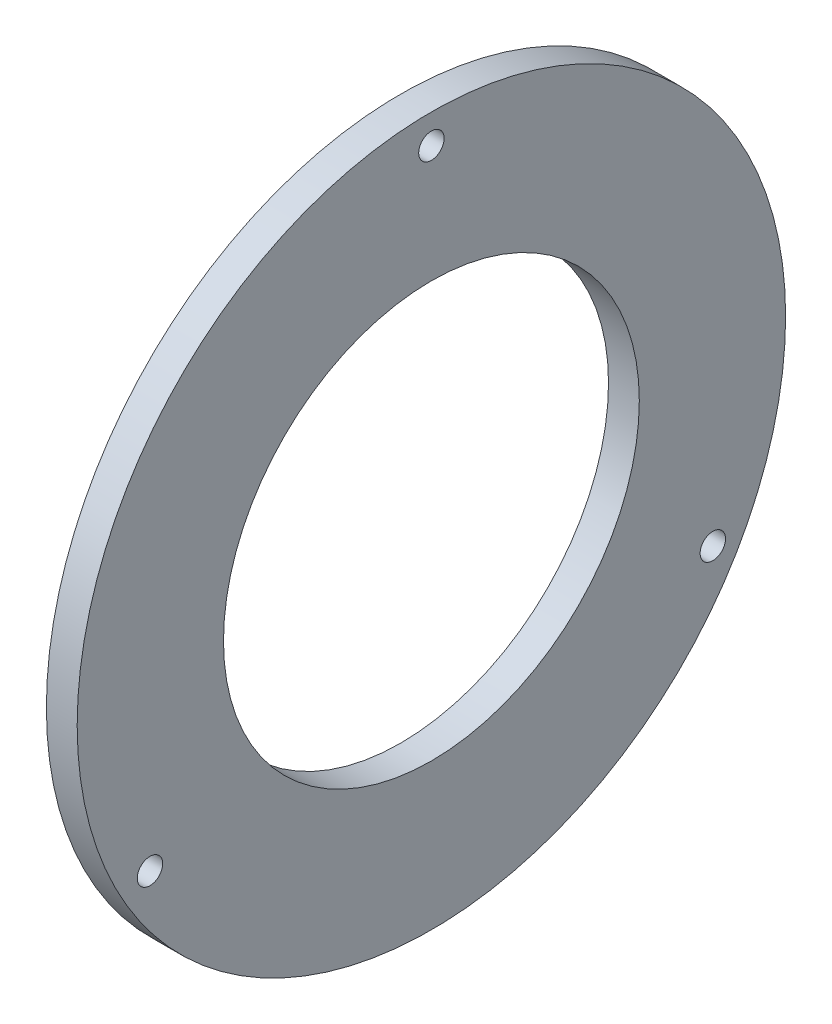
ISO-10303-21;
HEADER;
FILE_DESCRIPTION(('STEP AP214'),'2;1');
FILE_NAME('part.step','',(''),(''),'','','');
FILE_SCHEMA(('AUTOMOTIVE_DESIGN { 1 0 10303 214 1 1 1 1 }'));
ENDSEC;
DATA;
#1=APPLICATION_CONTEXT('core data for automotive mechanical design processes');
#2=APPLICATION_PROTOCOL_DEFINITION('international standard','automotive_design',2000,#1);
#3=PRODUCT_CONTEXT('',#1,'mechanical');
#4=PRODUCT('Part','Part','',(#3));
#5=PRODUCT_RELATED_PRODUCT_CATEGORY('part','',(#4));
#6=PRODUCT_DEFINITION_FORMATION('','',#4);
#7=PRODUCT_DEFINITION_CONTEXT('part definition',#1,'design');
#8=PRODUCT_DEFINITION('design','',#6,#7);
#9=PRODUCT_DEFINITION_SHAPE('','',#8);
#10=(LENGTH_UNIT() NAMED_UNIT(*) SI_UNIT(.MILLI.,.METRE.));
#11=(NAMED_UNIT(*) PLANE_ANGLE_UNIT() SI_UNIT($,.RADIAN.));
#12=(NAMED_UNIT(*) SI_UNIT($,.STERADIAN.) SOLID_ANGLE_UNIT());
#13=UNCERTAINTY_MEASURE_WITH_UNIT(LENGTH_MEASURE(1.E-05),#10,'distance_accuracy_value','');
#14=(GEOMETRIC_REPRESENTATION_CONTEXT(3) GLOBAL_UNCERTAINTY_ASSIGNED_CONTEXT((#13)) GLOBAL_UNIT_ASSIGNED_CONTEXT((#10,
#11,#12)) REPRESENTATION_CONTEXT('',''));
#15=CARTESIAN_POINT('',(0.,0.,0.));
#16=DIRECTION('',(0.,0.,1.));
#17=DIRECTION('',(1.,0.,0.));
#18=AXIS2_PLACEMENT_3D('',#15,#16,#17);
#19=CARTESIAN_POINT('',(131.7,46.,0.));
#20=DIRECTION('',(1.,0.,0.));
#21=DIRECTION('',(0.,0.,-1.));
#22=AXIS2_PLACEMENT_3D('',#19,#20,#21);
#23=PLANE('',#22);
#24=CARTESIAN_POINT('',(131.7,42.2,0.));
#25=DIRECTION('',(1.,0.,0.));
#26=DIRECTION('',(0.,0.,-1.));
#27=AXIS2_PLACEMENT_3D('',#24,#25,#26);
#28=CIRCLE('',#27,1.65);
#29=CARTESIAN_POINT('',(131.7,42.2,-1.65));
#30=VERTEX_POINT('',#29);
#31=EDGE_CURVE('E50',#30,#30,#28,.F.);
#32=ORIENTED_EDGE('',*,*,#31,.F.);
#33=EDGE_LOOP('',(#32));
#34=FACE_BOUND('',#33,.T.);
#35=CARTESIAN_POINT('',(131.7,-21.1,36.5462720397033));
#36=DIRECTION('',(1.,0.,0.));
#37=DIRECTION('',(0.,0.,-1.));
#38=AXIS2_PLACEMENT_3D('',#35,#36,#37);
#39=CIRCLE('',#38,1.65);
#40=CARTESIAN_POINT('',(131.7,-21.1,34.8962720397033));
#41=VERTEX_POINT('',#40);
#42=EDGE_CURVE('E53',#41,#41,#39,.F.);
#43=ORIENTED_EDGE('',*,*,#42,.F.);
#44=EDGE_LOOP('',(#43));
#45=FACE_BOUND('',#44,.T.);
#46=CARTESIAN_POINT('',(131.7,-21.1,-36.5462720397033));
#47=DIRECTION('',(1.,0.,0.));
#48=DIRECTION('',(0.,0.,-1.));
#49=AXIS2_PLACEMENT_3D('',#46,#47,#48);
#50=CIRCLE('',#49,1.65);
#51=CARTESIAN_POINT('',(131.7,-21.1,-38.1962720397033));
#52=VERTEX_POINT('',#51);
#53=EDGE_CURVE('E56',#52,#52,#50,.F.);
#54=ORIENTED_EDGE('',*,*,#53,.F.);
#55=EDGE_LOOP('',(#54));
#56=FACE_BOUND('',#55,.T.);
#57=CARTESIAN_POINT('',(131.7,0.,0.));
#58=DIRECTION('',(-1.,0.,0.));
#59=DIRECTION('',(0.,0.,1.));
#60=AXIS2_PLACEMENT_3D('',#57,#58,#59);
#61=CIRCLE('',#60,27.);
#62=CARTESIAN_POINT('',(131.7,0.,27.));
#63=VERTEX_POINT('',#62);
#64=EDGE_CURVE('E10',#63,#63,#61,.T.);
#65=ORIENTED_EDGE('',*,*,#64,.F.);
#66=EDGE_LOOP('',(#65));
#67=FACE_BOUND('',#66,.T.);
#68=CARTESIAN_POINT('',(131.7,0.,0.));
#69=DIRECTION('',(-1.,0.,0.));
#70=DIRECTION('',(0.,0.,1.));
#71=AXIS2_PLACEMENT_3D('',#68,#69,#70);
#72=CIRCLE('',#71,46.);
#73=CARTESIAN_POINT('',(131.7,0.,46.));
#74=VERTEX_POINT('',#73);
#75=EDGE_CURVE('E45',#74,#74,#72,.T.);
#76=ORIENTED_EDGE('',*,*,#75,.T.);
#77=EDGE_LOOP('',(#76));
#78=FACE_BOUND('',#77,.T.);
#79=ADVANCED_FACE('F31',(#34,#45,#56,#67,#78),#23,.F.);
#80=CARTESIAN_POINT('',(-110.,0.,0.));
#81=DIRECTION('',(-1.,0.,0.));
#82=DIRECTION('',(0.,0.,1.));
#83=AXIS2_PLACEMENT_3D('',#80,#81,#82);
#84=CYLINDRICAL_SURFACE('',#83,27.);
#85=CARTESIAN_POINT('',(135.7,0.,0.));
#86=DIRECTION('',(-1.,0.,0.));
#87=DIRECTION('',(0.,0.,1.));
#88=AXIS2_PLACEMENT_3D('',#85,#86,#87);
#89=CIRCLE('',#88,27.);
#90=CARTESIAN_POINT('',(135.7,0.,27.));
#91=VERTEX_POINT('',#90);
#92=EDGE_CURVE('E37',#91,#91,#89,.T.);
#93=ORIENTED_EDGE('',*,*,#92,.F.);
#94=EDGE_LOOP('',(#93));
#95=FACE_BOUND('',#94,.T.);
#96=ORIENTED_EDGE('',*,*,#64,.T.);
#97=EDGE_LOOP('',(#96));
#98=FACE_BOUND('',#97,.T.);
#99=ADVANCED_FACE('F76',(#95,#98),#84,.F.);
#100=CARTESIAN_POINT('',(135.7,27.,0.));
#101=DIRECTION('',(-1.,0.,0.));
#102=DIRECTION('',(0.,0.,1.));
#103=AXIS2_PLACEMENT_3D('',#100,#101,#102);
#104=PLANE('',#103);
#105=CARTESIAN_POINT('',(135.7,42.2,0.));
#106=DIRECTION('',(1.,0.,0.));
#107=DIRECTION('',(0.,0.,-1.));
#108=AXIS2_PLACEMENT_3D('',#105,#106,#107);
#109=CIRCLE('',#108,1.65);
#110=CARTESIAN_POINT('',(135.7,42.2,-1.65));
#111=VERTEX_POINT('',#110);
#112=EDGE_CURVE('E59',#111,#111,#109,.T.);
#113=ORIENTED_EDGE('',*,*,#112,.F.);
#114=EDGE_LOOP('',(#113));
#115=FACE_BOUND('',#114,.T.);
#116=CARTESIAN_POINT('',(135.7,-21.1,36.5462720397033));
#117=DIRECTION('',(1.,0.,0.));
#118=DIRECTION('',(0.,0.,-1.));
#119=AXIS2_PLACEMENT_3D('',#116,#117,#118);
#120=CIRCLE('',#119,1.65);
#121=CARTESIAN_POINT('',(135.7,-21.1,34.8962720397033));
#122=VERTEX_POINT('',#121);
#123=EDGE_CURVE('E63',#122,#122,#120,.T.);
#124=ORIENTED_EDGE('',*,*,#123,.F.);
#125=EDGE_LOOP('',(#124));
#126=FACE_BOUND('',#125,.T.);
#127=CARTESIAN_POINT('',(135.7,-21.1,-36.5462720397033));
#128=DIRECTION('',(1.,0.,0.));
#129=DIRECTION('',(0.,0.,-1.));
#130=AXIS2_PLACEMENT_3D('',#127,#128,#129);
#131=CIRCLE('',#130,1.65);
#132=CARTESIAN_POINT('',(135.7,-21.1,-38.1962720397033));
#133=VERTEX_POINT('',#132);
#134=EDGE_CURVE('E60',#133,#133,#131,.T.);
#135=ORIENTED_EDGE('',*,*,#134,.F.);
#136=EDGE_LOOP('',(#135));
#137=FACE_BOUND('',#136,.T.);
#138=CARTESIAN_POINT('',(135.7,0.,0.));
#139=DIRECTION('',(-1.,0.,0.));
#140=DIRECTION('',(0.,0.,1.));
#141=AXIS2_PLACEMENT_3D('',#138,#139,#140);
#142=CIRCLE('',#141,46.);
#143=CARTESIAN_POINT('',(135.7,0.,46.));
#144=VERTEX_POINT('',#143);
#145=EDGE_CURVE('E41',#144,#144,#142,.T.);
#146=ORIENTED_EDGE('',*,*,#145,.F.);
#147=EDGE_LOOP('',(#146));
#148=FACE_BOUND('',#147,.T.);
#149=ORIENTED_EDGE('',*,*,#92,.T.);
#150=EDGE_LOOP('',(#149));
#151=FACE_BOUND('',#150,.T.);
#152=ADVANCED_FACE('F72',(#115,#126,#137,#148,#151),#104,.F.);
#153=CARTESIAN_POINT('',(-110.,0.,0.));
#154=DIRECTION('',(-1.,0.,0.));
#155=DIRECTION('',(0.,0.,1.));
#156=AXIS2_PLACEMENT_3D('',#153,#154,#155);
#157=CYLINDRICAL_SURFACE('',#156,46.);
#158=ORIENTED_EDGE('',*,*,#75,.F.);
#159=EDGE_LOOP('',(#158));
#160=FACE_BOUND('',#159,.T.);
#161=ORIENTED_EDGE('',*,*,#145,.T.);
#162=EDGE_LOOP('',(#161));
#163=FACE_BOUND('',#162,.T.);
#164=ADVANCED_FACE('F75',(#160,#163),#157,.T.);
#165=CARTESIAN_POINT('',(135.7,-21.1,-36.5462720397033));
#166=DIRECTION('',(-1.,0.,0.));
#167=DIRECTION('',(0.,0.,1.));
#168=AXIS2_PLACEMENT_3D('',#165,#166,#167);
#169=CYLINDRICAL_SURFACE('',#168,1.65);
#170=ORIENTED_EDGE('',*,*,#134,.T.);
#171=EDGE_LOOP('',(#170));
#172=FACE_BOUND('',#171,.T.);
#173=ORIENTED_EDGE('',*,*,#53,.T.);
#174=EDGE_LOOP('',(#173));
#175=FACE_BOUND('',#174,.T.);
#176=ADVANCED_FACE('F85',(#172,#175),#169,.F.);
#177=CARTESIAN_POINT('',(135.7,-21.1,36.5462720397033));
#178=DIRECTION('',(-1.,0.,0.));
#179=DIRECTION('',(0.,0.,1.));
#180=AXIS2_PLACEMENT_3D('',#177,#178,#179);
#181=CYLINDRICAL_SURFACE('',#180,1.65);
#182=ORIENTED_EDGE('',*,*,#123,.T.);
#183=EDGE_LOOP('',(#182));
#184=FACE_BOUND('',#183,.T.);
#185=ORIENTED_EDGE('',*,*,#42,.T.);
#186=EDGE_LOOP('',(#185));
#187=FACE_BOUND('',#186,.T.);
#188=ADVANCED_FACE('F91',(#184,#187),#181,.F.);
#189=CARTESIAN_POINT('',(135.7,42.2,0.));
#190=DIRECTION('',(-1.,0.,0.));
#191=DIRECTION('',(0.,0.,1.));
#192=AXIS2_PLACEMENT_3D('',#189,#190,#191);
#193=CYLINDRICAL_SURFACE('',#192,1.65);
#194=ORIENTED_EDGE('',*,*,#112,.T.);
#195=EDGE_LOOP('',(#194));
#196=FACE_BOUND('',#195,.T.);
#197=ORIENTED_EDGE('',*,*,#31,.T.);
#198=EDGE_LOOP('',(#197));
#199=FACE_BOUND('',#198,.T.);
#200=ADVANCED_FACE('F69',(#196,#199),#193,.F.);
#201=CLOSED_SHELL('',(#79,#99,#152,#164,#176,#188,#200));
#202=MANIFOLD_SOLID_BREP('B2',#201);
#203=ADVANCED_BREP_SHAPE_REPRESENTATION('',(#18,#202),#14);
#204=SHAPE_DEFINITION_REPRESENTATION(#9,#203);
ENDSEC;
END-ISO-10303-21;
